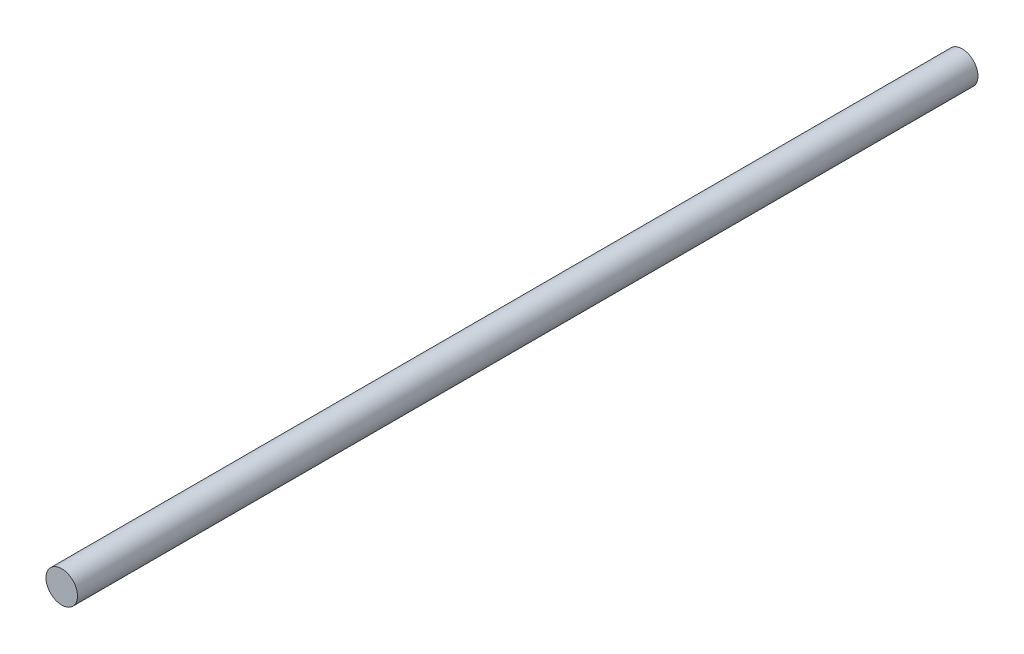
ISO-10303-21;
HEADER;
FILE_DESCRIPTION(('STEP AP214'),'2;1');
FILE_NAME('part.step','',(''),(''),'','','');
FILE_SCHEMA(('AUTOMOTIVE_DESIGN { 1 0 10303 214 1 1 1 1 }'));
ENDSEC;
DATA;
#1=APPLICATION_CONTEXT('core data for automotive mechanical design processes');
#2=APPLICATION_PROTOCOL_DEFINITION('international standard','automotive_design',2000,#1);
#3=PRODUCT_CONTEXT('',#1,'mechanical');
#4=PRODUCT('Part','Part','',(#3));
#5=PRODUCT_RELATED_PRODUCT_CATEGORY('part','',(#4));
#6=PRODUCT_DEFINITION_FORMATION('','',#4);
#7=PRODUCT_DEFINITION_CONTEXT('part definition',#1,'design');
#8=PRODUCT_DEFINITION('design','',#6,#7);
#9=PRODUCT_DEFINITION_SHAPE('','',#8);
#10=(LENGTH_UNIT() NAMED_UNIT(*) SI_UNIT(.MILLI.,.METRE.));
#11=(NAMED_UNIT(*) PLANE_ANGLE_UNIT() SI_UNIT($,.RADIAN.));
#12=(NAMED_UNIT(*) SI_UNIT($,.STERADIAN.) SOLID_ANGLE_UNIT());
#13=UNCERTAINTY_MEASURE_WITH_UNIT(LENGTH_MEASURE(1.E-05),#10,'distance_accuracy_value','');
#14=(GEOMETRIC_REPRESENTATION_CONTEXT(3) GLOBAL_UNCERTAINTY_ASSIGNED_CONTEXT((#13)) GLOBAL_UNIT_ASSIGNED_CONTEXT((#10,
#11,#12)) REPRESENTATION_CONTEXT('',''));
#15=CARTESIAN_POINT('',(0.,0.,0.));
#16=DIRECTION('',(0.,0.,1.));
#17=DIRECTION('',(1.,0.,0.));
#18=AXIS2_PLACEMENT_3D('',#15,#16,#17);
#19=CARTESIAN_POINT('',(0.,0.,40.));
#20=DIRECTION('',(0.,0.,-1.));
#21=DIRECTION('',(-1.,0.,0.));
#22=AXIS2_PLACEMENT_3D('',#19,#20,#21);
#23=CYLINDRICAL_SURFACE('',#22,0.7);
#24=CARTESIAN_POINT('',(0.,0.,40.));
#25=DIRECTION('',(0.,0.,1.));
#26=DIRECTION('',(1.,0.,0.));
#27=AXIS2_PLACEMENT_3D('',#24,#25,#26);
#28=CIRCLE('',#27,0.7);
#29=CARTESIAN_POINT('',(0.7,0.,40.));
#30=VERTEX_POINT('',#29);
#31=EDGE_CURVE('E10',#30,#30,#28,.T.);
#32=ORIENTED_EDGE('',*,*,#31,.F.);
#33=EDGE_LOOP('',(#32));
#34=FACE_BOUND('',#33,.T.);
#35=CARTESIAN_POINT('',(0.,0.,0.));
#36=DIRECTION('',(0.,0.,1.));
#37=DIRECTION('',(1.,0.,0.));
#38=AXIS2_PLACEMENT_3D('',#35,#36,#37);
#39=CIRCLE('',#38,0.7);
#40=CARTESIAN_POINT('',(0.7,0.,0.));
#41=VERTEX_POINT('',#40);
#42=EDGE_CURVE('E34',#41,#41,#39,.T.);
#43=ORIENTED_EDGE('',*,*,#42,.T.);
#44=EDGE_LOOP('',(#43));
#45=FACE_BOUND('',#44,.T.);
#46=ADVANCED_FACE('F31',(#34,#45),#23,.T.);
#47=CARTESIAN_POINT('',(0.,0.,40.));
#48=DIRECTION('',(0.,0.,1.));
#49=DIRECTION('',(1.,0.,0.));
#50=AXIS2_PLACEMENT_3D('',#47,#48,#49);
#51=PLANE('',#50);
#52=ORIENTED_EDGE('',*,*,#31,.T.);
#53=EDGE_LOOP('',(#52));
#54=FACE_BOUND('',#53,.T.);
#55=ADVANCED_FACE('F46',(#54),#51,.T.);
#56=CARTESIAN_POINT('',(0.,0.,0.));
#57=DIRECTION('',(0.,0.,1.));
#58=DIRECTION('',(1.,0.,0.));
#59=AXIS2_PLACEMENT_3D('',#56,#57,#58);
#60=PLANE('',#59);
#61=ORIENTED_EDGE('',*,*,#42,.F.);
#62=EDGE_LOOP('',(#61));
#63=FACE_BOUND('',#62,.T.);
#64=ADVANCED_FACE('F44',(#63),#60,.F.);
#65=CLOSED_SHELL('',(#46,#55,#64));
#66=MANIFOLD_SOLID_BREP('B2',#65);
#67=ADVANCED_BREP_SHAPE_REPRESENTATION('',(#18,#66),#14);
#68=SHAPE_DEFINITION_REPRESENTATION(#9,#67);
ENDSEC;
END-ISO-10303-21;
